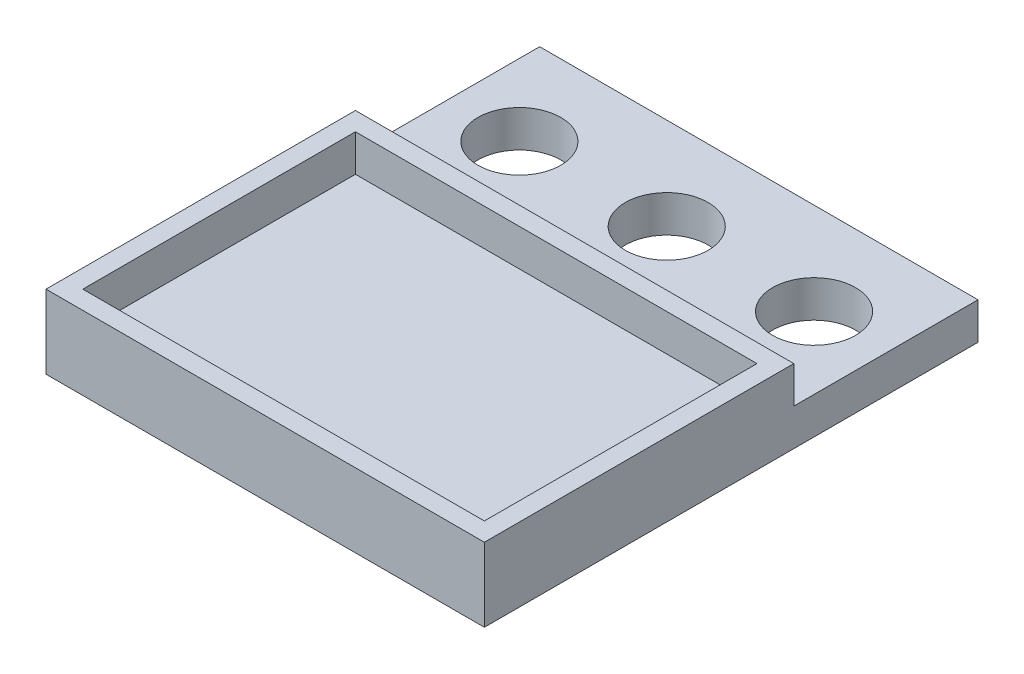
ISO-10303-21;
HEADER;
FILE_DESCRIPTION(('STEP AP214'),'2;1');
FILE_NAME('part.step','',(''),(''),'','','');
FILE_SCHEMA(('AUTOMOTIVE_DESIGN { 1 0 10303 214 1 1 1 1 }'));
ENDSEC;
DATA;
#1=APPLICATION_CONTEXT('core data for automotive mechanical design processes');
#2=APPLICATION_PROTOCOL_DEFINITION('international standard','automotive_design',2000,#1);
#3=PRODUCT_CONTEXT('',#1,'mechanical');
#4=PRODUCT('Part','Part','',(#3));
#5=PRODUCT_RELATED_PRODUCT_CATEGORY('part','',(#4));
#6=PRODUCT_DEFINITION_FORMATION('','',#4);
#7=PRODUCT_DEFINITION_CONTEXT('part definition',#1,'design');
#8=PRODUCT_DEFINITION('design','',#6,#7);
#9=PRODUCT_DEFINITION_SHAPE('','',#8);
#10=(LENGTH_UNIT() NAMED_UNIT(*) SI_UNIT(.MILLI.,.METRE.));
#11=(NAMED_UNIT(*) PLANE_ANGLE_UNIT() SI_UNIT($,.RADIAN.));
#12=(NAMED_UNIT(*) SI_UNIT($,.STERADIAN.) SOLID_ANGLE_UNIT());
#13=UNCERTAINTY_MEASURE_WITH_UNIT(LENGTH_MEASURE(1.E-05),#10,'distance_accuracy_value','');
#14=(GEOMETRIC_REPRESENTATION_CONTEXT(3) GLOBAL_UNCERTAINTY_ASSIGNED_CONTEXT((#13)) GLOBAL_UNIT_ASSIGNED_CONTEXT((#10,
#11,#12)) REPRESENTATION_CONTEXT('',''));
#15=CARTESIAN_POINT('',(0.,0.,0.));
#16=DIRECTION('',(0.,0.,1.));
#17=DIRECTION('',(1.,0.,0.));
#18=AXIS2_PLACEMENT_3D('',#15,#16,#17);
#19=CARTESIAN_POINT('',(-11.9,2.,0.));
#20=DIRECTION('',(-1.,0.,0.));
#21=DIRECTION('',(0.,0.,1.));
#22=AXIS2_PLACEMENT_3D('',#19,#20,#21);
#23=PLANE('',#22);
#24=DIRECTION('',(0.,0.,-1.));
#25=VECTOR('',#24,1.);
#26=CARTESIAN_POINT('',(-11.9,0.,0.));
#27=LINE('',#26,#25);
#28=CARTESIAN_POINT('',(-11.9,0.,8.4));
#29=VERTEX_POINT('',#28);
#30=CARTESIAN_POINT('',(-11.9,0.,-18.4));
#31=VERTEX_POINT('',#30);
#32=EDGE_CURVE('E188',#29,#31,#27,.T.);
#33=ORIENTED_EDGE('',*,*,#32,.F.);
#34=DIRECTION('',(0.,-1.,0.));
#35=VECTOR('',#34,1.);
#36=CARTESIAN_POINT('',(-11.9,2.,8.4));
#37=LINE('',#36,#35);
#38=CARTESIAN_POINT('',(-11.9,4.,8.4));
#39=VERTEX_POINT('',#38);
#40=EDGE_CURVE('E12',#39,#29,#37,.T.);
#41=ORIENTED_EDGE('',*,*,#40,.F.);
#42=DIRECTION('',(0.,0.,-1.));
#43=VECTOR('',#42,1.);
#44=CARTESIAN_POINT('',(-11.9,4.,0.));
#45=LINE('',#44,#43);
#46=CARTESIAN_POINT('',(-11.9,4.,-8.4));
#47=VERTEX_POINT('',#46);
#48=EDGE_CURVE('E173',#39,#47,#45,.T.);
#49=ORIENTED_EDGE('',*,*,#48,.T.);
#50=DIRECTION('',(0.,-1.,0.));
#51=VECTOR('',#50,1.);
#52=CARTESIAN_POINT('',(-11.9,4.,-8.4));
#53=LINE('',#52,#51);
#54=CARTESIAN_POINT('',(-11.9,2.,-8.4));
#55=VERTEX_POINT('',#54);
#56=EDGE_CURVE('E183',#47,#55,#53,.T.);
#57=ORIENTED_EDGE('',*,*,#56,.T.);
#58=DIRECTION('',(0.,0.,-1.));
#59=VECTOR('',#58,1.);
#60=CARTESIAN_POINT('',(-11.9,2.,0.));
#61=LINE('',#60,#59);
#62=CARTESIAN_POINT('',(-11.9,2.,-18.4));
#63=VERTEX_POINT('',#62);
#64=EDGE_CURVE('E191',#55,#63,#61,.T.);
#65=ORIENTED_EDGE('',*,*,#64,.T.);
#66=DIRECTION('',(0.,-1.,0.));
#67=VECTOR('',#66,1.);
#68=CARTESIAN_POINT('',(-11.9,2.,-18.4));
#69=LINE('',#68,#67);
#70=EDGE_CURVE('E208',#63,#31,#69,.T.);
#71=ORIENTED_EDGE('',*,*,#70,.T.);
#72=EDGE_LOOP('',(#33,#41,#49,#57,#65,#71));
#73=FACE_BOUND('',#72,.T.);
#74=ADVANCED_FACE('F59',(#73),#23,.T.);
#75=CARTESIAN_POINT('',(0.,2.,8.4));
#76=DIRECTION('',(0.,0.,-1.));
#77=DIRECTION('',(-1.,0.,0.));
#78=AXIS2_PLACEMENT_3D('',#75,#76,#77);
#79=PLANE('',#78);
#80=DIRECTION('',(1.,0.,0.));
#81=VECTOR('',#80,1.);
#82=CARTESIAN_POINT('',(0.,0.,8.4));
#83=LINE('',#82,#81);
#84=CARTESIAN_POINT('',(11.9,0.,8.4));
#85=VERTEX_POINT('',#84);
#86=EDGE_CURVE('E211',#29,#85,#83,.T.);
#87=ORIENTED_EDGE('',*,*,#86,.T.);
#88=DIRECTION('',(0.,-1.,0.));
#89=VECTOR('',#88,1.);
#90=CARTESIAN_POINT('',(11.9,2.,8.4));
#91=LINE('',#90,#89);
#92=CARTESIAN_POINT('',(11.9,4.,8.4));
#93=VERTEX_POINT('',#92);
#94=EDGE_CURVE('E66',#93,#85,#91,.T.);
#95=ORIENTED_EDGE('',*,*,#94,.F.);
#96=DIRECTION('',(-1.,0.,0.));
#97=VECTOR('',#96,1.);
#98=CARTESIAN_POINT('',(0.,4.,8.4));
#99=LINE('',#98,#97);
#100=EDGE_CURVE('E180',#93,#39,#99,.T.);
#101=ORIENTED_EDGE('',*,*,#100,.T.);
#102=ORIENTED_EDGE('',*,*,#40,.T.);
#103=EDGE_LOOP('',(#87,#95,#101,#102));
#104=FACE_BOUND('',#103,.T.);
#105=ADVANCED_FACE('F253',(#104),#79,.F.);
#106=CARTESIAN_POINT('',(11.9,2.,0.));
#107=DIRECTION('',(-1.,0.,0.));
#108=DIRECTION('',(0.,0.,1.));
#109=AXIS2_PLACEMENT_3D('',#106,#107,#108);
#110=PLANE('',#109);
#111=DIRECTION('',(0.,0.,-1.));
#112=VECTOR('',#111,1.);
#113=CARTESIAN_POINT('',(11.9,0.,0.));
#114=LINE('',#113,#112);
#115=CARTESIAN_POINT('',(11.9,0.,-18.4));
#116=VERTEX_POINT('',#115);
#117=EDGE_CURVE('E213',#85,#116,#114,.T.);
#118=ORIENTED_EDGE('',*,*,#117,.T.);
#119=DIRECTION('',(0.,-1.,0.));
#120=VECTOR('',#119,1.);
#121=CARTESIAN_POINT('',(11.9,2.,-18.4));
#122=LINE('',#121,#120);
#123=CARTESIAN_POINT('',(11.9,2.,-18.4));
#124=VERTEX_POINT('',#123);
#125=EDGE_CURVE('E228',#124,#116,#122,.T.);
#126=ORIENTED_EDGE('',*,*,#125,.F.);
#127=DIRECTION('',(0.,0.,-1.));
#128=VECTOR('',#127,1.);
#129=CARTESIAN_POINT('',(11.9,2.,0.));
#130=LINE('',#129,#128);
#131=CARTESIAN_POINT('',(11.9,2.,-8.4));
#132=VERTEX_POINT('',#131);
#133=EDGE_CURVE('E193',#132,#124,#130,.T.);
#134=ORIENTED_EDGE('',*,*,#133,.F.);
#135=DIRECTION('',(0.,-1.,0.));
#136=VECTOR('',#135,1.);
#137=CARTESIAN_POINT('',(11.9,4.,-8.4));
#138=LINE('',#137,#136);
#139=CARTESIAN_POINT('',(11.9,4.,-8.4));
#140=VERTEX_POINT('',#139);
#141=EDGE_CURVE('E185',#140,#132,#138,.T.);
#142=ORIENTED_EDGE('',*,*,#141,.F.);
#143=DIRECTION('',(0.,0.,-1.));
#144=VECTOR('',#143,1.);
#145=CARTESIAN_POINT('',(11.9,4.,0.));
#146=LINE('',#145,#144);
#147=EDGE_CURVE('E178',#93,#140,#146,.T.);
#148=ORIENTED_EDGE('',*,*,#147,.F.);
#149=ORIENTED_EDGE('',*,*,#94,.T.);
#150=EDGE_LOOP('',(#118,#126,#134,#142,#148,#149));
#151=FACE_BOUND('',#150,.T.);
#152=ADVANCED_FACE('F233',(#151),#110,.F.);
#153=CARTESIAN_POINT('',(-8.,2.,-13.4));
#154=DIRECTION('',(0.,-1.,0.));
#155=DIRECTION('',(0.,0.,-1.));
#156=AXIS2_PLACEMENT_3D('',#153,#154,#155);
#157=CYLINDRICAL_SURFACE('',#156,2.25);
#158=CARTESIAN_POINT('',(-8.,2.,-13.4));
#159=DIRECTION('',(0.,1.,0.));
#160=DIRECTION('',(0.,0.,1.));
#161=AXIS2_PLACEMENT_3D('',#158,#159,#160);
#162=CIRCLE('',#161,2.25);
#163=CARTESIAN_POINT('',(-8.,2.,-11.15));
#164=VERTEX_POINT('',#163);
#165=EDGE_CURVE('E202',#164,#164,#162,.T.);
#166=ORIENTED_EDGE('',*,*,#165,.T.);
#167=EDGE_LOOP('',(#166));
#168=FACE_BOUND('',#167,.T.);
#169=CARTESIAN_POINT('',(-8.,0.,-13.4));
#170=DIRECTION('',(0.,1.,0.));
#171=DIRECTION('',(0.,0.,1.));
#172=AXIS2_PLACEMENT_3D('',#169,#170,#171);
#173=CIRCLE('',#172,2.25);
#174=CARTESIAN_POINT('',(-8.,0.,-11.15));
#175=VERTEX_POINT('',#174);
#176=EDGE_CURVE('E222',#175,#175,#173,.T.);
#177=ORIENTED_EDGE('',*,*,#176,.F.);
#178=EDGE_LOOP('',(#177));
#179=FACE_BOUND('',#178,.T.);
#180=ADVANCED_FACE('F285',(#168,#179),#157,.F.);
#181=CARTESIAN_POINT('',(0.,2.,-13.4));
#182=DIRECTION('',(0.,-1.,0.));
#183=DIRECTION('',(0.,0.,-1.));
#184=AXIS2_PLACEMENT_3D('',#181,#182,#183);
#185=CYLINDRICAL_SURFACE('',#184,2.25);
#186=CARTESIAN_POINT('',(0.,2.,-13.4));
#187=DIRECTION('',(0.,1.,0.));
#188=DIRECTION('',(0.,0.,1.));
#189=AXIS2_PLACEMENT_3D('',#186,#187,#188);
#190=CIRCLE('',#189,2.25);
#191=CARTESIAN_POINT('',(0.,2.,-11.15));
#192=VERTEX_POINT('',#191);
#193=EDGE_CURVE('E199',#192,#192,#190,.T.);
#194=ORIENTED_EDGE('',*,*,#193,.T.);
#195=EDGE_LOOP('',(#194));
#196=FACE_BOUND('',#195,.T.);
#197=CARTESIAN_POINT('',(0.,0.,-13.4));
#198=DIRECTION('',(0.,1.,0.));
#199=DIRECTION('',(0.,0.,1.));
#200=AXIS2_PLACEMENT_3D('',#197,#198,#199);
#201=CIRCLE('',#200,2.25);
#202=CARTESIAN_POINT('',(0.,0.,-11.15));
#203=VERTEX_POINT('',#202);
#204=EDGE_CURVE('E219',#203,#203,#201,.T.);
#205=ORIENTED_EDGE('',*,*,#204,.F.);
#206=EDGE_LOOP('',(#205));
#207=FACE_BOUND('',#206,.T.);
#208=ADVANCED_FACE('F290',(#196,#207),#185,.F.);
#209=CARTESIAN_POINT('',(0.,2.,-18.4));
#210=DIRECTION('',(0.,0.,-1.));
#211=DIRECTION('',(-1.,0.,0.));
#212=AXIS2_PLACEMENT_3D('',#209,#210,#211);
#213=PLANE('',#212);
#214=DIRECTION('',(1.,0.,0.));
#215=VECTOR('',#214,1.);
#216=CARTESIAN_POINT('',(0.,0.,-18.4));
#217=LINE('',#216,#215);
#218=EDGE_CURVE('E216',#31,#116,#217,.T.);
#219=ORIENTED_EDGE('',*,*,#218,.F.);
#220=ORIENTED_EDGE('',*,*,#70,.F.);
#221=DIRECTION('',(1.,0.,0.));
#222=VECTOR('',#221,1.);
#223=CARTESIAN_POINT('',(0.,2.,-18.4));
#224=LINE('',#223,#222);
#225=EDGE_CURVE('E196',#63,#124,#224,.T.);
#226=ORIENTED_EDGE('',*,*,#225,.T.);
#227=ORIENTED_EDGE('',*,*,#125,.T.);
#228=EDGE_LOOP('',(#219,#220,#226,#227));
#229=FACE_BOUND('',#228,.T.);
#230=ADVANCED_FACE('F246',(#229),#213,.T.);
#231=CARTESIAN_POINT('',(8.,2.,-13.4));
#232=DIRECTION('',(0.,-1.,0.));
#233=DIRECTION('',(0.,0.,-1.));
#234=AXIS2_PLACEMENT_3D('',#231,#232,#233);
#235=CYLINDRICAL_SURFACE('',#234,2.25);
#236=CARTESIAN_POINT('',(8.,2.,-13.4));
#237=DIRECTION('',(0.,1.,0.));
#238=DIRECTION('',(0.,0.,1.));
#239=AXIS2_PLACEMENT_3D('',#236,#237,#238);
#240=CIRCLE('',#239,2.25);
#241=CARTESIAN_POINT('',(8.,2.,-11.15));
#242=VERTEX_POINT('',#241);
#243=EDGE_CURVE('E205',#242,#242,#240,.F.);
#244=ORIENTED_EDGE('',*,*,#243,.F.);
#245=EDGE_LOOP('',(#244));
#246=FACE_BOUND('',#245,.T.);
#247=CARTESIAN_POINT('',(8.,0.,-13.4));
#248=DIRECTION('',(0.,1.,0.));
#249=DIRECTION('',(0.,0.,1.));
#250=AXIS2_PLACEMENT_3D('',#247,#248,#249);
#251=CIRCLE('',#250,2.25);
#252=CARTESIAN_POINT('',(8.,0.,-11.15));
#253=VERTEX_POINT('',#252);
#254=EDGE_CURVE('E194',#253,#253,#251,.F.);
#255=ORIENTED_EDGE('',*,*,#254,.T.);
#256=EDGE_LOOP('',(#255));
#257=FACE_BOUND('',#256,.T.);
#258=ADVANCED_FACE('F258',(#246,#257),#235,.F.);
#259=CARTESIAN_POINT('',(0.,2.,0.));
#260=DIRECTION('',(0.,1.,0.));
#261=DIRECTION('',(0.,0.,1.));
#262=AXIS2_PLACEMENT_3D('',#259,#260,#261);
#263=PLANE('',#262);
#264=DIRECTION('',(-1.,0.,0.));
#265=VECTOR('',#264,1.);
#266=CARTESIAN_POINT('',(0.,2.,-8.4));
#267=LINE('',#266,#265);
#268=EDGE_CURVE('E81',#132,#55,#267,.T.);
#269=ORIENTED_EDGE('',*,*,#268,.F.);
#270=ORIENTED_EDGE('',*,*,#133,.T.);
#271=ORIENTED_EDGE('',*,*,#225,.F.);
#272=ORIENTED_EDGE('',*,*,#64,.F.);
#273=EDGE_LOOP('',(#269,#270,#271,#272));
#274=FACE_BOUND('',#273,.T.);
#275=ORIENTED_EDGE('',*,*,#193,.F.);
#276=EDGE_LOOP('',(#275));
#277=FACE_BOUND('',#276,.T.);
#278=ORIENTED_EDGE('',*,*,#165,.F.);
#279=EDGE_LOOP('',(#278));
#280=FACE_BOUND('',#279,.T.);
#281=ORIENTED_EDGE('',*,*,#243,.T.);
#282=EDGE_LOOP('',(#281));
#283=FACE_BOUND('',#282,.T.);
#284=ADVANCED_FACE('F255',(#274,#277,#280,#283),#263,.T.);
#285=CARTESIAN_POINT('',(0.,0.,0.));
#286=DIRECTION('',(0.,1.,0.));
#287=DIRECTION('',(0.,0.,1.));
#288=AXIS2_PLACEMENT_3D('',#285,#286,#287);
#289=PLANE('',#288);
#290=ORIENTED_EDGE('',*,*,#32,.T.);
#291=ORIENTED_EDGE('',*,*,#218,.T.);
#292=ORIENTED_EDGE('',*,*,#117,.F.);
#293=ORIENTED_EDGE('',*,*,#86,.F.);
#294=EDGE_LOOP('',(#290,#291,#292,#293));
#295=FACE_BOUND('',#294,.T.);
#296=ORIENTED_EDGE('',*,*,#204,.T.);
#297=EDGE_LOOP('',(#296));
#298=FACE_BOUND('',#297,.T.);
#299=ORIENTED_EDGE('',*,*,#176,.T.);
#300=EDGE_LOOP('',(#299));
#301=FACE_BOUND('',#300,.T.);
#302=ORIENTED_EDGE('',*,*,#254,.F.);
#303=EDGE_LOOP('',(#302));
#304=FACE_BOUND('',#303,.T.);
#305=ADVANCED_FACE('F240',(#295,#298,#301,#304),#289,.F.);
#306=CARTESIAN_POINT('',(0.,4.,-8.4));
#307=DIRECTION('',(0.,0.,1.));
#308=DIRECTION('',(1.,0.,0.));
#309=AXIS2_PLACEMENT_3D('',#306,#307,#308);
#310=PLANE('',#309);
#311=ORIENTED_EDGE('',*,*,#268,.T.);
#312=ORIENTED_EDGE('',*,*,#56,.F.);
#313=DIRECTION('',(-1.,0.,0.));
#314=VECTOR('',#313,1.);
#315=CARTESIAN_POINT('',(0.,4.,-8.4));
#316=LINE('',#315,#314);
#317=EDGE_CURVE('E176',#140,#47,#316,.T.);
#318=ORIENTED_EDGE('',*,*,#317,.F.);
#319=ORIENTED_EDGE('',*,*,#141,.T.);
#320=EDGE_LOOP('',(#311,#312,#318,#319));
#321=FACE_BOUND('',#320,.T.);
#322=ADVANCED_FACE('F250',(#321),#310,.F.);
#323=CARTESIAN_POINT('',(0.,4.,0.));
#324=DIRECTION('',(0.,1.,0.));
#325=DIRECTION('',(0.,0.,1.));
#326=AXIS2_PLACEMENT_3D('',#323,#324,#325);
#327=PLANE('',#326);
#328=DIRECTION('',(0.,0.,-1.));
#329=VECTOR('',#328,1.);
#330=CARTESIAN_POINT('',(-10.9,4.,0.));
#331=LINE('',#330,#329);
#332=CARTESIAN_POINT('',(-10.9,4.,7.4));
#333=VERTEX_POINT('',#332);
#334=CARTESIAN_POINT('',(-10.9,4.,-7.4));
#335=VERTEX_POINT('',#334);
#336=EDGE_CURVE('E143',#333,#335,#331,.T.);
#337=ORIENTED_EDGE('',*,*,#336,.T.);
#338=DIRECTION('',(-1.,0.,0.));
#339=VECTOR('',#338,1.);
#340=CARTESIAN_POINT('',(0.,4.,-7.4));
#341=LINE('',#340,#339);
#342=CARTESIAN_POINT('',(10.9,4.,-7.4));
#343=VERTEX_POINT('',#342);
#344=EDGE_CURVE('E133',#343,#335,#341,.T.);
#345=ORIENTED_EDGE('',*,*,#344,.F.);
#346=DIRECTION('',(0.,0.,-1.));
#347=VECTOR('',#346,1.);
#348=CARTESIAN_POINT('',(10.9,4.,0.));
#349=LINE('',#348,#347);
#350=CARTESIAN_POINT('',(10.9,4.,7.4));
#351=VERTEX_POINT('',#350);
#352=EDGE_CURVE('E142',#351,#343,#349,.T.);
#353=ORIENTED_EDGE('',*,*,#352,.F.);
#354=DIRECTION('',(-1.,0.,0.));
#355=VECTOR('',#354,1.);
#356=CARTESIAN_POINT('',(0.,4.,7.4));
#357=LINE('',#356,#355);
#358=EDGE_CURVE('E151',#351,#333,#357,.T.);
#359=ORIENTED_EDGE('',*,*,#358,.T.);
#360=EDGE_LOOP('',(#337,#345,#353,#359));
#361=FACE_BOUND('',#360,.T.);
#362=ORIENTED_EDGE('',*,*,#48,.F.);
#363=ORIENTED_EDGE('',*,*,#100,.F.);
#364=ORIENTED_EDGE('',*,*,#147,.T.);
#365=ORIENTED_EDGE('',*,*,#317,.T.);
#366=EDGE_LOOP('',(#362,#363,#364,#365));
#367=FACE_BOUND('',#366,.T.);
#368=ADVANCED_FACE('F153',(#361,#367),#327,.T.);
#369=CARTESIAN_POINT('',(-10.9,4.,0.));
#370=DIRECTION('',(-1.,0.,0.));
#371=DIRECTION('',(0.,0.,1.));
#372=AXIS2_PLACEMENT_3D('',#369,#370,#371);
#373=PLANE('',#372);
#374=DIRECTION('',(0.,0.,-1.));
#375=VECTOR('',#374,1.);
#376=CARTESIAN_POINT('',(-10.9,2.,0.));
#377=LINE('',#376,#375);
#378=CARTESIAN_POINT('',(-10.9,2.,7.4));
#379=VERTEX_POINT('',#378);
#380=CARTESIAN_POINT('',(-10.9,2.,-7.4));
#381=VERTEX_POINT('',#380);
#382=EDGE_CURVE('E150',#379,#381,#377,.T.);
#383=ORIENTED_EDGE('',*,*,#382,.T.);
#384=DIRECTION('',(0.,-1.,0.));
#385=VECTOR('',#384,1.);
#386=CARTESIAN_POINT('',(-10.9,4.,-7.4));
#387=LINE('',#386,#385);
#388=EDGE_CURVE('E136',#335,#381,#387,.T.);
#389=ORIENTED_EDGE('',*,*,#388,.F.);
#390=ORIENTED_EDGE('',*,*,#336,.F.);
#391=DIRECTION('',(0.,-1.,0.));
#392=VECTOR('',#391,1.);
#393=CARTESIAN_POINT('',(-10.9,4.,7.4));
#394=LINE('',#393,#392);
#395=EDGE_CURVE('E168',#333,#379,#394,.T.);
#396=ORIENTED_EDGE('',*,*,#395,.T.);
#397=EDGE_LOOP('',(#383,#389,#390,#396));
#398=FACE_BOUND('',#397,.T.);
#399=ADVANCED_FACE('F147',(#398),#373,.F.);
#400=CARTESIAN_POINT('',(0.,4.,7.4));
#401=DIRECTION('',(0.,0.,1.));
#402=DIRECTION('',(1.,0.,0.));
#403=AXIS2_PLACEMENT_3D('',#400,#401,#402);
#404=PLANE('',#403);
#405=DIRECTION('',(-1.,0.,0.));
#406=VECTOR('',#405,1.);
#407=CARTESIAN_POINT('',(0.,2.,7.4));
#408=LINE('',#407,#406);
#409=CARTESIAN_POINT('',(10.9,2.,7.4));
#410=VERTEX_POINT('',#409);
#411=EDGE_CURVE('E156',#410,#379,#408,.T.);
#412=ORIENTED_EDGE('',*,*,#411,.T.);
#413=ORIENTED_EDGE('',*,*,#395,.F.);
#414=ORIENTED_EDGE('',*,*,#358,.F.);
#415=DIRECTION('',(0.,-1.,0.));
#416=VECTOR('',#415,1.);
#417=CARTESIAN_POINT('',(10.9,4.,7.4));
#418=LINE('',#417,#416);
#419=EDGE_CURVE('E170',#351,#410,#418,.T.);
#420=ORIENTED_EDGE('',*,*,#419,.T.);
#421=EDGE_LOOP('',(#412,#413,#414,#420));
#422=FACE_BOUND('',#421,.T.);
#423=ADVANCED_FACE('F346',(#422),#404,.F.);
#424=CARTESIAN_POINT('',(10.9,4.,0.));
#425=DIRECTION('',(-1.,0.,0.));
#426=DIRECTION('',(0.,0.,1.));
#427=AXIS2_PLACEMENT_3D('',#424,#425,#426);
#428=PLANE('',#427);
#429=DIRECTION('',(0.,0.,-1.));
#430=VECTOR('',#429,1.);
#431=CARTESIAN_POINT('',(10.9,2.,0.));
#432=LINE('',#431,#430);
#433=CARTESIAN_POINT('',(10.9,2.,-7.4));
#434=VERTEX_POINT('',#433);
#435=EDGE_CURVE('E159',#410,#434,#432,.T.);
#436=ORIENTED_EDGE('',*,*,#435,.F.);
#437=ORIENTED_EDGE('',*,*,#419,.F.);
#438=ORIENTED_EDGE('',*,*,#352,.T.);
#439=DIRECTION('',(0.,-1.,0.));
#440=VECTOR('',#439,1.);
#441=CARTESIAN_POINT('',(10.9,4.,-7.4));
#442=LINE('',#441,#440);
#443=EDGE_CURVE('E137',#343,#434,#442,.T.);
#444=ORIENTED_EDGE('',*,*,#443,.T.);
#445=EDGE_LOOP('',(#436,#437,#438,#444));
#446=FACE_BOUND('',#445,.T.);
#447=ADVANCED_FACE('F355',(#446),#428,.T.);
#448=CARTESIAN_POINT('',(0.,4.,-7.4));
#449=DIRECTION('',(0.,0.,1.));
#450=DIRECTION('',(1.,0.,0.));
#451=AXIS2_PLACEMENT_3D('',#448,#449,#450);
#452=PLANE('',#451);
#453=DIRECTION('',(-1.,0.,0.));
#454=VECTOR('',#453,1.);
#455=CARTESIAN_POINT('',(0.,2.,-7.4));
#456=LINE('',#455,#454);
#457=EDGE_CURVE('E73',#434,#381,#456,.T.);
#458=ORIENTED_EDGE('',*,*,#457,.F.);
#459=ORIENTED_EDGE('',*,*,#443,.F.);
#460=ORIENTED_EDGE('',*,*,#344,.T.);
#461=ORIENTED_EDGE('',*,*,#388,.T.);
#462=EDGE_LOOP('',(#458,#459,#460,#461));
#463=FACE_BOUND('',#462,.T.);
#464=ADVANCED_FACE('F135',(#463),#452,.T.);
#465=ORIENTED_EDGE('',*,*,#435,.T.);
#466=ORIENTED_EDGE('',*,*,#457,.T.);
#467=ORIENTED_EDGE('',*,*,#382,.F.);
#468=ORIENTED_EDGE('',*,*,#411,.F.);
#469=EDGE_LOOP('',(#465,#466,#467,#468));
#470=FACE_BOUND('',#469,.T.);
#471=ADVANCED_FACE('F260',(#470),#263,.T.);
#472=CLOSED_SHELL('',(#74,#105,#152,#180,#208,#230,#258,#284,#305,#322,#368,#399,#423,#447,#464,#471));
#473=MANIFOLD_SOLID_BREP('B2',#472);
#474=ADVANCED_BREP_SHAPE_REPRESENTATION('',(#18,#473),#14);
#475=SHAPE_DEFINITION_REPRESENTATION(#9,#474);
ENDSEC;
END-ISO-10303-21;
